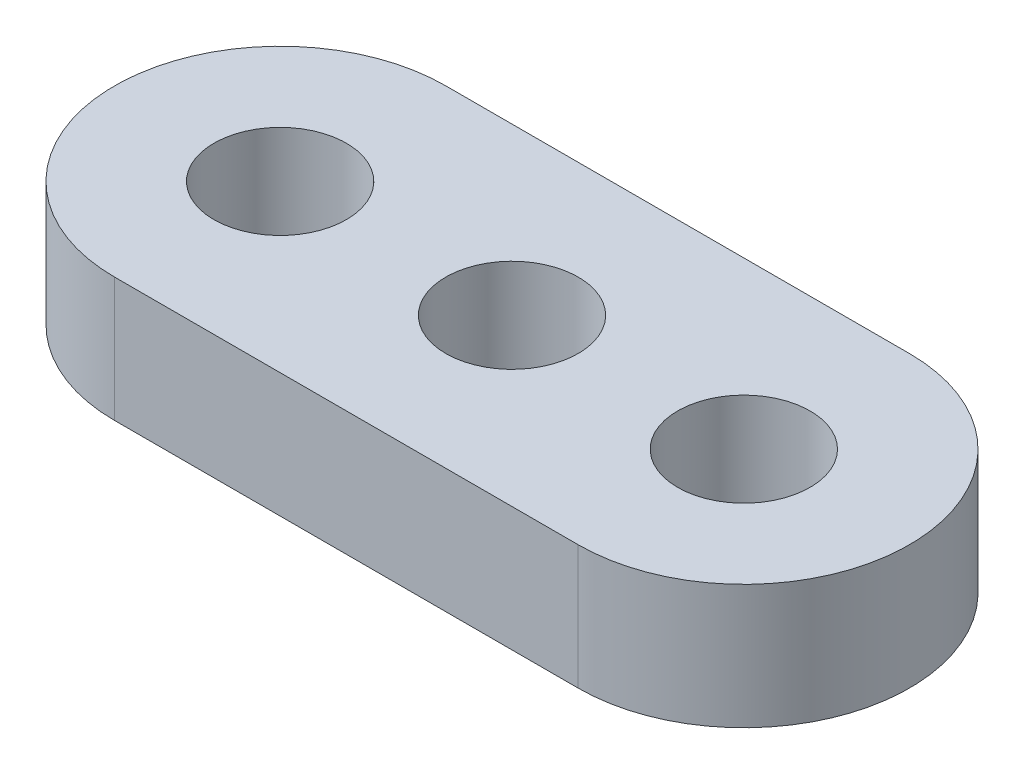
ISO-10303-21;
HEADER;
FILE_DESCRIPTION(('STEP AP214'),'2;1');
FILE_NAME('part.step','',(''),(''),'','','');
FILE_SCHEMA(('AUTOMOTIVE_DESIGN { 1 0 10303 214 1 1 1 1 }'));
ENDSEC;
DATA;
#1=APPLICATION_CONTEXT('core data for automotive mechanical design processes');
#2=APPLICATION_PROTOCOL_DEFINITION('international standard','automotive_design',2000,#1);
#3=PRODUCT_CONTEXT('',#1,'mechanical');
#4=PRODUCT('Part','Part','',(#3));
#5=PRODUCT_RELATED_PRODUCT_CATEGORY('part','',(#4));
#6=PRODUCT_DEFINITION_FORMATION('','',#4);
#7=PRODUCT_DEFINITION_CONTEXT('part definition',#1,'design');
#8=PRODUCT_DEFINITION('design','',#6,#7);
#9=PRODUCT_DEFINITION_SHAPE('','',#8);
#10=(LENGTH_UNIT() NAMED_UNIT(*) SI_UNIT(.MILLI.,.METRE.));
#11=(NAMED_UNIT(*) PLANE_ANGLE_UNIT() SI_UNIT($,.RADIAN.));
#12=(NAMED_UNIT(*) SI_UNIT($,.STERADIAN.) SOLID_ANGLE_UNIT());
#13=UNCERTAINTY_MEASURE_WITH_UNIT(LENGTH_MEASURE(1.E-05),#10,'distance_accuracy_value','');
#14=(GEOMETRIC_REPRESENTATION_CONTEXT(3) GLOBAL_UNCERTAINTY_ASSIGNED_CONTEXT((#13)) GLOBAL_UNIT_ASSIGNED_CONTEXT((#10,
#11,#12)) REPRESENTATION_CONTEXT('',''));
#15=CARTESIAN_POINT('',(0.,0.,0.));
#16=DIRECTION('',(0.,0.,1.));
#17=DIRECTION('',(1.,0.,0.));
#18=AXIS2_PLACEMENT_3D('',#15,#16,#17);
#19=CARTESIAN_POINT('',(-5.6,3.,0.));
#20=DIRECTION('',(0.,1.,0.));
#21=DIRECTION('',(0.,0.,1.));
#22=AXIS2_PLACEMENT_3D('',#19,#20,#21);
#23=PLANE('',#22);
#24=CARTESIAN_POINT('',(5.6,3.,0.));
#25=DIRECTION('',(0.,1.,0.));
#26=DIRECTION('',(0.,0.,1.));
#27=AXIS2_PLACEMENT_3D('',#24,#25,#26);
#28=CIRCLE('',#27,1.6);
#29=CARTESIAN_POINT('',(5.6,3.,1.6));
#30=VERTEX_POINT('',#29);
#31=EDGE_CURVE('E117',#30,#30,#28,.T.);
#32=ORIENTED_EDGE('',*,*,#31,.F.);
#33=EDGE_LOOP('',(#32));
#34=FACE_BOUND('',#33,.T.);
#35=CARTESIAN_POINT('',(-5.6,3.,0.));
#36=DIRECTION('',(0.,1.,0.));
#37=DIRECTION('',(0.,0.,1.));
#38=AXIS2_PLACEMENT_3D('',#35,#36,#37);
#39=CIRCLE('',#38,4.);
#40=CARTESIAN_POINT('',(-5.6,3.,-4.));
#41=VERTEX_POINT('',#40);
#42=CARTESIAN_POINT('',(-5.6,3.,4.));
#43=VERTEX_POINT('',#42);
#44=EDGE_CURVE('E87',#41,#43,#39,.T.);
#45=ORIENTED_EDGE('',*,*,#44,.T.);
#46=DIRECTION('',(1.,0.,0.));
#47=VECTOR('',#46,1.);
#48=CARTESIAN_POINT('',(-5.6,3.,4.));
#49=LINE('',#48,#47);
#50=CARTESIAN_POINT('',(5.6,3.,4.));
#51=VERTEX_POINT('',#50);
#52=EDGE_CURVE('E82',#43,#51,#49,.T.);
#53=ORIENTED_EDGE('',*,*,#52,.T.);
#54=CARTESIAN_POINT('',(5.6,3.,0.));
#55=DIRECTION('',(0.,1.,0.));
#56=DIRECTION('',(0.,0.,1.));
#57=AXIS2_PLACEMENT_3D('',#54,#55,#56);
#58=CIRCLE('',#57,4.);
#59=CARTESIAN_POINT('',(5.6,3.,-4.));
#60=VERTEX_POINT('',#59);
#61=EDGE_CURVE('E85',#51,#60,#58,.T.);
#62=ORIENTED_EDGE('',*,*,#61,.T.);
#63=DIRECTION('',(-1.,0.,0.));
#64=VECTOR('',#63,1.);
#65=CARTESIAN_POINT('',(-5.6,3.,-4.));
#66=LINE('',#65,#64);
#67=EDGE_CURVE('E52',#60,#41,#66,.T.);
#68=ORIENTED_EDGE('',*,*,#67,.T.);
#69=EDGE_LOOP('',(#45,#53,#62,#68));
#70=FACE_BOUND('',#69,.T.);
#71=CARTESIAN_POINT('',(-5.6,3.,0.));
#72=DIRECTION('',(0.,1.,0.));
#73=DIRECTION('',(0.,0.,1.));
#74=AXIS2_PLACEMENT_3D('',#71,#72,#73);
#75=CIRCLE('',#74,1.6);
#76=CARTESIAN_POINT('',(-5.6,3.,1.6));
#77=VERTEX_POINT('',#76);
#78=EDGE_CURVE('E102',#77,#77,#75,.T.);
#79=ORIENTED_EDGE('',*,*,#78,.F.);
#80=EDGE_LOOP('',(#79));
#81=FACE_BOUND('',#80,.T.);
#82=CARTESIAN_POINT('',(0.,3.,0.));
#83=DIRECTION('',(0.,1.,0.));
#84=DIRECTION('',(0.,0.,1.));
#85=AXIS2_PLACEMENT_3D('',#82,#83,#84);
#86=CIRCLE('',#85,1.6);
#87=CARTESIAN_POINT('',(0.,3.,1.6));
#88=VERTEX_POINT('',#87);
#89=EDGE_CURVE('E123',#88,#88,#86,.T.);
#90=ORIENTED_EDGE('',*,*,#89,.F.);
#91=EDGE_LOOP('',(#90));
#92=FACE_BOUND('',#91,.T.);
#93=ADVANCED_FACE('F35',(#34,#70,#81,#92),#23,.T.);
#94=CARTESIAN_POINT('',(-5.6,0.,0.));
#95=DIRECTION('',(0.,1.,0.));
#96=DIRECTION('',(0.,0.,1.));
#97=AXIS2_PLACEMENT_3D('',#94,#95,#96);
#98=PLANE('',#97);
#99=CARTESIAN_POINT('',(-5.6,0.,0.));
#100=DIRECTION('',(0.,1.,0.));
#101=DIRECTION('',(0.,0.,1.));
#102=AXIS2_PLACEMENT_3D('',#99,#100,#101);
#103=CIRCLE('',#102,4.);
#104=CARTESIAN_POINT('',(-5.6,0.,-4.));
#105=VERTEX_POINT('',#104);
#106=CARTESIAN_POINT('',(-5.6,0.,4.));
#107=VERTEX_POINT('',#106);
#108=EDGE_CURVE('E99',#105,#107,#103,.T.);
#109=ORIENTED_EDGE('',*,*,#108,.F.);
#110=DIRECTION('',(-1.,0.,0.));
#111=VECTOR('',#110,1.);
#112=CARTESIAN_POINT('',(-5.6,0.,-4.));
#113=LINE('',#112,#111);
#114=CARTESIAN_POINT('',(5.6,0.,-4.));
#115=VERTEX_POINT('',#114);
#116=EDGE_CURVE('E75',#115,#105,#113,.T.);
#117=ORIENTED_EDGE('',*,*,#116,.F.);
#118=CARTESIAN_POINT('',(5.6,0.,0.));
#119=DIRECTION('',(0.,1.,0.));
#120=DIRECTION('',(0.,0.,1.));
#121=AXIS2_PLACEMENT_3D('',#118,#119,#120);
#122=CIRCLE('',#121,4.);
#123=CARTESIAN_POINT('',(5.6,0.,4.));
#124=VERTEX_POINT('',#123);
#125=EDGE_CURVE('E69',#124,#115,#122,.T.);
#126=ORIENTED_EDGE('',*,*,#125,.F.);
#127=DIRECTION('',(1.,0.,0.));
#128=VECTOR('',#127,1.);
#129=CARTESIAN_POINT('',(-5.6,0.,4.));
#130=LINE('',#129,#128);
#131=EDGE_CURVE('E91',#107,#124,#130,.T.);
#132=ORIENTED_EDGE('',*,*,#131,.F.);
#133=EDGE_LOOP('',(#109,#117,#126,#132));
#134=FACE_BOUND('',#133,.T.);
#135=CARTESIAN_POINT('',(-5.6,0.,0.));
#136=DIRECTION('',(0.,1.,0.));
#137=DIRECTION('',(0.,0.,1.));
#138=AXIS2_PLACEMENT_3D('',#135,#136,#137);
#139=CIRCLE('',#138,1.6);
#140=CARTESIAN_POINT('',(-5.6,0.,1.6));
#141=VERTEX_POINT('',#140);
#142=EDGE_CURVE('E114',#141,#141,#139,.T.);
#143=ORIENTED_EDGE('',*,*,#142,.T.);
#144=EDGE_LOOP('',(#143));
#145=FACE_BOUND('',#144,.T.);
#146=CARTESIAN_POINT('',(5.6,0.,0.));
#147=DIRECTION('',(0.,1.,0.));
#148=DIRECTION('',(0.,0.,1.));
#149=AXIS2_PLACEMENT_3D('',#146,#147,#148);
#150=CIRCLE('',#149,1.6);
#151=CARTESIAN_POINT('',(5.6,0.,1.6));
#152=VERTEX_POINT('',#151);
#153=EDGE_CURVE('E120',#152,#152,#150,.T.);
#154=ORIENTED_EDGE('',*,*,#153,.T.);
#155=EDGE_LOOP('',(#154));
#156=FACE_BOUND('',#155,.T.);
#157=CARTESIAN_POINT('',(0.,0.,0.));
#158=DIRECTION('',(0.,1.,0.));
#159=DIRECTION('',(0.,0.,1.));
#160=AXIS2_PLACEMENT_3D('',#157,#158,#159);
#161=CIRCLE('',#160,1.6);
#162=CARTESIAN_POINT('',(0.,0.,1.6));
#163=VERTEX_POINT('',#162);
#164=EDGE_CURVE('E126',#163,#163,#161,.T.);
#165=ORIENTED_EDGE('',*,*,#164,.T.);
#166=EDGE_LOOP('',(#165));
#167=FACE_BOUND('',#166,.T.);
#168=ADVANCED_FACE('F110',(#134,#145,#156,#167),#98,.F.);
#169=CARTESIAN_POINT('',(-5.6,3.,0.));
#170=DIRECTION('',(0.,-1.,0.));
#171=DIRECTION('',(0.,0.,-1.));
#172=AXIS2_PLACEMENT_3D('',#169,#170,#171);
#173=CYLINDRICAL_SURFACE('',#172,4.);
#174=ORIENTED_EDGE('',*,*,#108,.T.);
#175=DIRECTION('',(0.,-1.,0.));
#176=VECTOR('',#175,1.);
#177=CARTESIAN_POINT('',(-5.6,3.,4.));
#178=LINE('',#177,#176);
#179=EDGE_CURVE('E11',#43,#107,#178,.T.);
#180=ORIENTED_EDGE('',*,*,#179,.F.);
#181=ORIENTED_EDGE('',*,*,#44,.F.);
#182=DIRECTION('',(0.,-1.,0.));
#183=VECTOR('',#182,1.);
#184=CARTESIAN_POINT('',(-5.6,3.,-4.));
#185=LINE('',#184,#183);
#186=EDGE_CURVE('E95',#41,#105,#185,.T.);
#187=ORIENTED_EDGE('',*,*,#186,.T.);
#188=EDGE_LOOP('',(#174,#180,#181,#187));
#189=FACE_BOUND('',#188,.T.);
#190=ADVANCED_FACE('F37',(#189),#173,.T.);
#191=CARTESIAN_POINT('',(-5.6,3.,4.));
#192=DIRECTION('',(0.,0.,-1.));
#193=DIRECTION('',(-1.,0.,0.));
#194=AXIS2_PLACEMENT_3D('',#191,#192,#193);
#195=PLANE('',#194);
#196=ORIENTED_EDGE('',*,*,#131,.T.);
#197=DIRECTION('',(0.,-1.,0.));
#198=VECTOR('',#197,1.);
#199=CARTESIAN_POINT('',(5.6,3.,4.));
#200=LINE('',#199,#198);
#201=EDGE_CURVE('E44',#51,#124,#200,.T.);
#202=ORIENTED_EDGE('',*,*,#201,.F.);
#203=ORIENTED_EDGE('',*,*,#52,.F.);
#204=ORIENTED_EDGE('',*,*,#179,.T.);
#205=EDGE_LOOP('',(#196,#202,#203,#204));
#206=FACE_BOUND('',#205,.T.);
#207=ADVANCED_FACE('F90',(#206),#195,.F.);
#208=CARTESIAN_POINT('',(5.6,3.,0.));
#209=DIRECTION('',(0.,-1.,0.));
#210=DIRECTION('',(0.,0.,-1.));
#211=AXIS2_PLACEMENT_3D('',#208,#209,#210);
#212=CYLINDRICAL_SURFACE('',#211,4.);
#213=ORIENTED_EDGE('',*,*,#125,.T.);
#214=DIRECTION('',(0.,-1.,0.));
#215=VECTOR('',#214,1.);
#216=CARTESIAN_POINT('',(5.6,3.,-4.));
#217=LINE('',#216,#215);
#218=EDGE_CURVE('E92',#60,#115,#217,.T.);
#219=ORIENTED_EDGE('',*,*,#218,.F.);
#220=ORIENTED_EDGE('',*,*,#61,.F.);
#221=ORIENTED_EDGE('',*,*,#201,.T.);
#222=EDGE_LOOP('',(#213,#219,#220,#221));
#223=FACE_BOUND('',#222,.T.);
#224=ADVANCED_FACE('F93',(#223),#212,.T.);
#225=CARTESIAN_POINT('',(-5.6,3.,-4.));
#226=DIRECTION('',(0.,0.,1.));
#227=DIRECTION('',(1.,0.,0.));
#228=AXIS2_PLACEMENT_3D('',#225,#226,#227);
#229=PLANE('',#228);
#230=ORIENTED_EDGE('',*,*,#116,.T.);
#231=ORIENTED_EDGE('',*,*,#186,.F.);
#232=ORIENTED_EDGE('',*,*,#67,.F.);
#233=ORIENTED_EDGE('',*,*,#218,.T.);
#234=EDGE_LOOP('',(#230,#231,#232,#233));
#235=FACE_BOUND('',#234,.T.);
#236=ADVANCED_FACE('F107',(#235),#229,.F.);
#237=CARTESIAN_POINT('',(-5.6,3.,0.));
#238=DIRECTION('',(0.,-1.,0.));
#239=DIRECTION('',(0.,0.,-1.));
#240=AXIS2_PLACEMENT_3D('',#237,#238,#239);
#241=CYLINDRICAL_SURFACE('',#240,1.6);
#242=ORIENTED_EDGE('',*,*,#78,.T.);
#243=EDGE_LOOP('',(#242));
#244=FACE_BOUND('',#243,.T.);
#245=ORIENTED_EDGE('',*,*,#142,.F.);
#246=EDGE_LOOP('',(#245));
#247=FACE_BOUND('',#246,.T.);
#248=ADVANCED_FACE('F144',(#244,#247),#241,.F.);
#249=CARTESIAN_POINT('',(5.6,3.,0.));
#250=DIRECTION('',(0.,-1.,0.));
#251=DIRECTION('',(0.,0.,-1.));
#252=AXIS2_PLACEMENT_3D('',#249,#250,#251);
#253=CYLINDRICAL_SURFACE('',#252,1.6);
#254=ORIENTED_EDGE('',*,*,#31,.T.);
#255=EDGE_LOOP('',(#254));
#256=FACE_BOUND('',#255,.T.);
#257=ORIENTED_EDGE('',*,*,#153,.F.);
#258=EDGE_LOOP('',(#257));
#259=FACE_BOUND('',#258,.T.);
#260=ADVANCED_FACE('F190',(#256,#259),#253,.F.);
#261=CARTESIAN_POINT('',(0.,3.,0.));
#262=DIRECTION('',(0.,-1.,0.));
#263=DIRECTION('',(0.,0.,-1.));
#264=AXIS2_PLACEMENT_3D('',#261,#262,#263);
#265=CYLINDRICAL_SURFACE('',#264,1.6);
#266=ORIENTED_EDGE('',*,*,#89,.T.);
#267=EDGE_LOOP('',(#266));
#268=FACE_BOUND('',#267,.T.);
#269=ORIENTED_EDGE('',*,*,#164,.F.);
#270=EDGE_LOOP('',(#269));
#271=FACE_BOUND('',#270,.T.);
#272=ADVANCED_FACE('F132',(#268,#271),#265,.F.);
#273=CLOSED_SHELL('',(#93,#168,#190,#207,#224,#236,#248,#260,#272));
#274=MANIFOLD_SOLID_BREP('B2',#273);
#275=ADVANCED_BREP_SHAPE_REPRESENTATION('',(#18,#274),#14);
#276=SHAPE_DEFINITION_REPRESENTATION(#9,#275);
ENDSEC;
END-ISO-10303-21;
